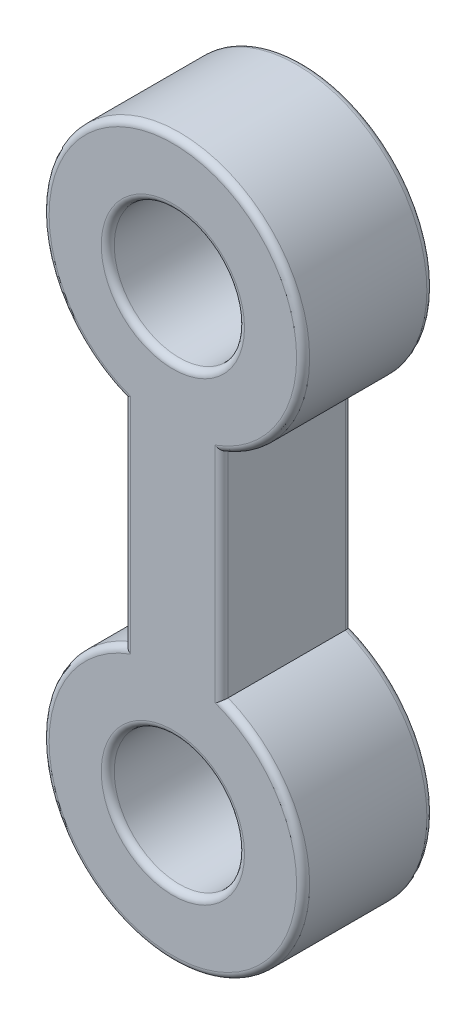
ISO-10303-21;
HEADER;
FILE_DESCRIPTION(('STEP AP214'),'2;1');
FILE_NAME('part.step','',(''),(''),'','','');
FILE_SCHEMA(('AUTOMOTIVE_DESIGN { 1 0 10303 214 1 1 1 1 }'));
ENDSEC;
DATA;
#1=APPLICATION_CONTEXT('core data for automotive mechanical design processes');
#2=APPLICATION_PROTOCOL_DEFINITION('international standard','automotive_design',2000,#1);
#3=PRODUCT_CONTEXT('',#1,'mechanical');
#4=PRODUCT('Part','Part','',(#3));
#5=PRODUCT_RELATED_PRODUCT_CATEGORY('part','',(#4));
#6=PRODUCT_DEFINITION_FORMATION('','',#4);
#7=PRODUCT_DEFINITION_CONTEXT('part definition',#1,'design');
#8=PRODUCT_DEFINITION('design','',#6,#7);
#9=PRODUCT_DEFINITION_SHAPE('','',#8);
#10=(LENGTH_UNIT() NAMED_UNIT(*) SI_UNIT(.MILLI.,.METRE.));
#11=(NAMED_UNIT(*) PLANE_ANGLE_UNIT() SI_UNIT($,.RADIAN.));
#12=(NAMED_UNIT(*) SI_UNIT($,.STERADIAN.) SOLID_ANGLE_UNIT());
#13=UNCERTAINTY_MEASURE_WITH_UNIT(LENGTH_MEASURE(1.E-05),#10,'distance_accuracy_value','');
#14=(GEOMETRIC_REPRESENTATION_CONTEXT(3) GLOBAL_UNCERTAINTY_ASSIGNED_CONTEXT((#13)) GLOBAL_UNIT_ASSIGNED_CONTEXT((#10,
#11,#12)) REPRESENTATION_CONTEXT('',''));
#15=CARTESIAN_POINT('',(0.,0.,0.));
#16=DIRECTION('',(0.,0.,1.));
#17=DIRECTION('',(1.,0.,0.));
#18=AXIS2_PLACEMENT_3D('',#15,#16,#17);
#19=CARTESIAN_POINT('',(0.,0.,10.));
#20=DIRECTION('',(0.,0.,1.));
#21=DIRECTION('',(1.,0.,0.));
#22=AXIS2_PLACEMENT_3D('',#19,#20,#21);
#23=PLANE('',#22);
#24=CARTESIAN_POINT('',(0.,-70.0000000000001,10.));
#25=DIRECTION('',(0.,0.,1.));
#26=DIRECTION('',(1.,0.,0.));
#27=AXIS2_PLACEMENT_3D('',#24,#25,#26);
#28=CIRCLE('',#27,11.);
#29=CARTESIAN_POINT('',(11.,-70.0000000000001,10.));
#30=VERTEX_POINT('',#29);
#31=EDGE_CURVE('E11',#30,#30,#28,.F.);
#32=ORIENTED_EDGE('',*,*,#31,.T.);
#33=EDGE_LOOP('',(#32));
#34=FACE_BOUND('',#33,.T.);
#35=CARTESIAN_POINT('',(0.,-70.0000000000001,10.));
#36=DIRECTION('',(0.,0.,1.));
#37=DIRECTION('',(1.,0.,0.));
#38=AXIS2_PLACEMENT_3D('',#35,#36,#37);
#39=CIRCLE('',#38,19.);
#40=CARTESIAN_POINT('',(-6.49999999999998,-52.1464289286429,10.));
#41=VERTEX_POINT('',#40);
#42=CARTESIAN_POINT('',(6.49999999999999,-52.1464289286429,10.));
#43=VERTEX_POINT('',#42);
#44=EDGE_CURVE('E66',#41,#43,#39,.T.);
#45=ORIENTED_EDGE('',*,*,#44,.T.);
#46=DIRECTION('',(0.,1.,0.));
#47=VECTOR('',#46,1.);
#48=CARTESIAN_POINT('',(6.49999999999998,-18.5404962177392,10.));
#49=LINE('',#48,#47);
#50=CARTESIAN_POINT('',(6.49999999999998,-17.8535710713571,10.));
#51=VERTEX_POINT('',#50);
#52=EDGE_CURVE('E58',#43,#51,#49,.T.);
#53=ORIENTED_EDGE('',*,*,#52,.T.);
#54=CARTESIAN_POINT('',(0.,0.,10.));
#55=DIRECTION('',(0.,0.,1.));
#56=DIRECTION('',(1.,0.,0.));
#57=AXIS2_PLACEMENT_3D('',#54,#55,#56);
#58=CIRCLE('',#57,19.);
#59=CARTESIAN_POINT('',(-6.49999999999998,-17.8535710713571,10.));
#60=VERTEX_POINT('',#59);
#61=EDGE_CURVE('E203',#51,#60,#58,.T.);
#62=ORIENTED_EDGE('',*,*,#61,.T.);
#63=DIRECTION('',(0.,-1.,0.));
#64=VECTOR('',#63,1.);
#65=CARTESIAN_POINT('',(-6.49999999999998,-51.4595037822609,10.));
#66=LINE('',#65,#64);
#67=EDGE_CURVE('E71',#60,#41,#66,.T.);
#68=ORIENTED_EDGE('',*,*,#67,.T.);
#69=EDGE_LOOP('',(#45,#53,#62,#68));
#70=FACE_BOUND('',#69,.T.);
#71=CARTESIAN_POINT('',(0.,0.,10.));
#72=DIRECTION('',(0.,0.,1.));
#73=DIRECTION('',(1.,0.,0.));
#74=AXIS2_PLACEMENT_3D('',#71,#72,#73);
#75=CIRCLE('',#74,11.);
#76=CARTESIAN_POINT('',(11.,0.,10.));
#77=VERTEX_POINT('',#76);
#78=EDGE_CURVE('E199',#77,#77,#75,.F.);
#79=ORIENTED_EDGE('',*,*,#78,.T.);
#80=EDGE_LOOP('',(#79));
#81=FACE_BOUND('',#80,.T.);
#82=ADVANCED_FACE('F43',(#34,#70,#81),#23,.T.);
#83=CARTESIAN_POINT('',(0.,0.,-10.));
#84=DIRECTION('',(0.,0.,1.));
#85=DIRECTION('',(1.,0.,0.));
#86=AXIS2_PLACEMENT_3D('',#83,#84,#85);
#87=PLANE('',#86);
#88=CARTESIAN_POINT('',(0.,-70.0000000000001,-10.));
#89=DIRECTION('',(0.,0.,1.));
#90=DIRECTION('',(1.,0.,0.));
#91=AXIS2_PLACEMENT_3D('',#88,#89,#90);
#92=CIRCLE('',#91,11.);
#93=CARTESIAN_POINT('',(11.,-70.0000000000001,-10.));
#94=VERTEX_POINT('',#93);
#95=EDGE_CURVE('E151',#94,#94,#92,.T.);
#96=ORIENTED_EDGE('',*,*,#95,.T.);
#97=EDGE_LOOP('',(#96));
#98=FACE_BOUND('',#97,.T.);
#99=CARTESIAN_POINT('',(0.,0.,-10.));
#100=DIRECTION('',(0.,0.,1.));
#101=DIRECTION('',(1.,0.,0.));
#102=AXIS2_PLACEMENT_3D('',#99,#100,#101);
#103=CIRCLE('',#102,11.);
#104=CARTESIAN_POINT('',(11.,0.,-10.));
#105=VERTEX_POINT('',#104);
#106=EDGE_CURVE('E146',#105,#105,#103,.T.);
#107=ORIENTED_EDGE('',*,*,#106,.T.);
#108=EDGE_LOOP('',(#107));
#109=FACE_BOUND('',#108,.T.);
#110=CARTESIAN_POINT('',(0.,-70.0000000000001,-10.));
#111=DIRECTION('',(0.,0.,1.));
#112=DIRECTION('',(1.,0.,0.));
#113=AXIS2_PLACEMENT_3D('',#110,#111,#112);
#114=CIRCLE('',#113,19.);
#115=CARTESIAN_POINT('',(6.49999999999999,-52.1464289286429,-10.));
#116=VERTEX_POINT('',#115);
#117=CARTESIAN_POINT('',(-6.49999999999998,-52.1464289286429,-10.));
#118=VERTEX_POINT('',#117);
#119=EDGE_CURVE('E144',#116,#118,#114,.F.);
#120=ORIENTED_EDGE('',*,*,#119,.T.);
#121=DIRECTION('',(0.,-1.,0.));
#122=VECTOR('',#121,1.);
#123=CARTESIAN_POINT('',(-6.49999999999998,0.,-10.));
#124=LINE('',#123,#122);
#125=CARTESIAN_POINT('',(-6.49999999999998,-17.8535710713571,-10.));
#126=VERTEX_POINT('',#125);
#127=EDGE_CURVE('E121',#118,#126,#124,.F.);
#128=ORIENTED_EDGE('',*,*,#127,.T.);
#129=CARTESIAN_POINT('',(0.,0.,-10.));
#130=DIRECTION('',(0.,0.,1.));
#131=DIRECTION('',(1.,0.,0.));
#132=AXIS2_PLACEMENT_3D('',#129,#130,#131);
#133=CIRCLE('',#132,19.);
#134=CARTESIAN_POINT('',(6.49999999999998,-17.8535710713571,-10.));
#135=VERTEX_POINT('',#134);
#136=EDGE_CURVE('E132',#126,#135,#133,.F.);
#137=ORIENTED_EDGE('',*,*,#136,.T.);
#138=DIRECTION('',(0.,1.,0.));
#139=VECTOR('',#138,1.);
#140=CARTESIAN_POINT('',(6.49999999999998,0.,-10.));
#141=LINE('',#140,#139);
#142=EDGE_CURVE('E139',#135,#116,#141,.F.);
#143=ORIENTED_EDGE('',*,*,#142,.T.);
#144=EDGE_LOOP('',(#120,#128,#137,#143));
#145=FACE_BOUND('',#144,.T.);
#146=ADVANCED_FACE('F142',(#98,#109,#145),#87,.F.);
#147=CARTESIAN_POINT('',(0.,0.,10.));
#148=DIRECTION('',(0.,0.,-1.));
#149=DIRECTION('',(-1.,0.,0.));
#150=AXIS2_PLACEMENT_3D('',#147,#148,#149);
#151=CYLINDRICAL_SURFACE('',#150,20.);
#152=DIRECTION('',(0.,0.,-1.));
#153=VECTOR('',#152,1.);
#154=CARTESIAN_POINT('',(7.49999999999998,-18.5404962177392,10.));
#155=LINE('',#154,#153);
#156=CARTESIAN_POINT('',(7.49999999999998,-18.5404962177392,9.));
#157=VERTEX_POINT('',#156);
#158=CARTESIAN_POINT('',(7.49999999999998,-18.5404962177392,-9.));
#159=VERTEX_POINT('',#158);
#160=EDGE_CURVE('E364',#157,#159,#155,.T.);
#161=ORIENTED_EDGE('',*,*,#160,.T.);
#162=CARTESIAN_POINT('',(0.,0.,-9.));
#163=DIRECTION('',(0.,0.,1.));
#164=DIRECTION('',(1.,0.,0.));
#165=AXIS2_PLACEMENT_3D('',#162,#163,#164);
#166=CIRCLE('',#165,20.);
#167=CARTESIAN_POINT('',(-7.49999999999998,-18.5404962177392,-9.));
#168=VERTEX_POINT('',#167);
#169=EDGE_CURVE('E196',#159,#168,#166,.T.);
#170=ORIENTED_EDGE('',*,*,#169,.T.);
#171=DIRECTION('',(0.,0.,-1.));
#172=VECTOR('',#171,1.);
#173=CARTESIAN_POINT('',(-7.49999999999998,-18.5404962177392,10.));
#174=LINE('',#173,#172);
#175=CARTESIAN_POINT('',(-7.49999999999998,-18.5404962177392,9.));
#176=VERTEX_POINT('',#175);
#177=EDGE_CURVE('E140',#176,#168,#174,.T.);
#178=ORIENTED_EDGE('',*,*,#177,.F.);
#179=CARTESIAN_POINT('',(0.,0.,9.));
#180=DIRECTION('',(0.,0.,1.));
#181=DIRECTION('',(1.,0.,0.));
#182=AXIS2_PLACEMENT_3D('',#179,#180,#181);
#183=CIRCLE('',#182,20.);
#184=EDGE_CURVE('E193',#176,#157,#183,.F.);
#185=ORIENTED_EDGE('',*,*,#184,.T.);
#186=EDGE_LOOP('',(#161,#170,#178,#185));
#187=FACE_BOUND('',#186,.T.);
#188=ADVANCED_FACE('F302',(#187),#151,.T.);
#189=CARTESIAN_POINT('',(-7.49999999999998,-18.5404962177392,10.));
#190=DIRECTION('',(1.,0.,0.));
#191=DIRECTION('',(0.,0.,-1.));
#192=AXIS2_PLACEMENT_3D('',#189,#190,#191);
#193=PLANE('',#192);
#194=ORIENTED_EDGE('',*,*,#177,.T.);
#195=DIRECTION('',(0.,-1.,0.));
#196=VECTOR('',#195,1.);
#197=CARTESIAN_POINT('',(-7.49999999999998,-18.5404962177392,-9.));
#198=LINE('',#197,#196);
#199=CARTESIAN_POINT('',(-7.49999999999998,-51.4595037822609,-9.));
#200=VERTEX_POINT('',#199);
#201=EDGE_CURVE('E124',#168,#200,#198,.T.);
#202=ORIENTED_EDGE('',*,*,#201,.T.);
#203=DIRECTION('',(0.,0.,-1.));
#204=VECTOR('',#203,1.);
#205=CARTESIAN_POINT('',(-7.49999999999998,-51.4595037822609,10.));
#206=LINE('',#205,#204);
#207=CARTESIAN_POINT('',(-7.49999999999998,-51.4595037822609,9.));
#208=VERTEX_POINT('',#207);
#209=EDGE_CURVE('E367',#208,#200,#206,.T.);
#210=ORIENTED_EDGE('',*,*,#209,.F.);
#211=DIRECTION('',(0.,-1.,0.));
#212=VECTOR('',#211,1.);
#213=CARTESIAN_POINT('',(-7.49999999999998,-18.5404962177392,9.));
#214=LINE('',#213,#212);
#215=EDGE_CURVE('E175',#208,#176,#214,.F.);
#216=ORIENTED_EDGE('',*,*,#215,.T.);
#217=EDGE_LOOP('',(#194,#202,#210,#216));
#218=FACE_BOUND('',#217,.T.);
#219=ADVANCED_FACE('F316',(#218),#193,.F.);
#220=CARTESIAN_POINT('',(0.,-70.0000000000001,10.));
#221=DIRECTION('',(0.,0.,-1.));
#222=DIRECTION('',(-1.,0.,0.));
#223=AXIS2_PLACEMENT_3D('',#220,#221,#222);
#224=CYLINDRICAL_SURFACE('',#223,20.);
#225=ORIENTED_EDGE('',*,*,#209,.T.);
#226=CARTESIAN_POINT('',(0.,-70.0000000000001,-9.));
#227=DIRECTION('',(0.,0.,1.));
#228=DIRECTION('',(1.,0.,0.));
#229=AXIS2_PLACEMENT_3D('',#226,#227,#228);
#230=CIRCLE('',#229,20.);
#231=CARTESIAN_POINT('',(7.49999999999999,-51.4595037822609,-9.));
#232=VERTEX_POINT('',#231);
#233=EDGE_CURVE('E183',#200,#232,#230,.T.);
#234=ORIENTED_EDGE('',*,*,#233,.T.);
#235=DIRECTION('',(0.,0.,-1.));
#236=VECTOR('',#235,1.);
#237=CARTESIAN_POINT('',(7.49999999999999,-51.4595037822609,10.));
#238=LINE('',#237,#236);
#239=CARTESIAN_POINT('',(7.49999999999999,-51.4595037822609,9.));
#240=VERTEX_POINT('',#239);
#241=EDGE_CURVE('E361',#240,#232,#238,.T.);
#242=ORIENTED_EDGE('',*,*,#241,.F.);
#243=CARTESIAN_POINT('',(0.,-70.0000000000001,9.));
#244=DIRECTION('',(0.,0.,1.));
#245=DIRECTION('',(1.,0.,0.));
#246=AXIS2_PLACEMENT_3D('',#243,#244,#245);
#247=CIRCLE('',#246,20.);
#248=EDGE_CURVE('E180',#240,#208,#247,.F.);
#249=ORIENTED_EDGE('',*,*,#248,.T.);
#250=EDGE_LOOP('',(#225,#234,#242,#249));
#251=FACE_BOUND('',#250,.T.);
#252=ADVANCED_FACE('F312',(#251),#224,.T.);
#253=CARTESIAN_POINT('',(7.49999999999998,-18.5404962177392,10.));
#254=DIRECTION('',(-1.,0.,0.));
#255=DIRECTION('',(0.,-1.,0.));
#256=AXIS2_PLACEMENT_3D('',#253,#254,#255);
#257=PLANE('',#256);
#258=ORIENTED_EDGE('',*,*,#241,.T.);
#259=DIRECTION('',(0.,1.,0.));
#260=VECTOR('',#259,1.);
#261=CARTESIAN_POINT('',(7.49999999999998,-18.5404962177392,-9.));
#262=LINE('',#261,#260);
#263=EDGE_CURVE('E190',#232,#159,#262,.T.);
#264=ORIENTED_EDGE('',*,*,#263,.T.);
#265=ORIENTED_EDGE('',*,*,#160,.F.);
#266=DIRECTION('',(0.,1.,0.));
#267=VECTOR('',#266,1.);
#268=CARTESIAN_POINT('',(7.49999999999999,-51.4595037822609,9.));
#269=LINE('',#268,#267);
#270=EDGE_CURVE('E186',#157,#240,#269,.F.);
#271=ORIENTED_EDGE('',*,*,#270,.T.);
#272=EDGE_LOOP('',(#258,#264,#265,#271));
#273=FACE_BOUND('',#272,.T.);
#274=ADVANCED_FACE('F309',(#273),#257,.F.);
#275=CARTESIAN_POINT('',(0.,0.,10.));
#276=DIRECTION('',(0.,0.,-1.));
#277=DIRECTION('',(-1.,0.,0.));
#278=AXIS2_PLACEMENT_3D('',#275,#276,#277);
#279=CYLINDRICAL_SURFACE('',#278,9.99999999999999);
#280=CARTESIAN_POINT('',(0.,0.,-9.));
#281=DIRECTION('',(0.,0.,1.));
#282=DIRECTION('',(1.,0.,0.));
#283=AXIS2_PLACEMENT_3D('',#280,#281,#282);
#284=CIRCLE('',#283,9.99999999999999);
#285=CARTESIAN_POINT('',(9.99999999999999,0.,-9.));
#286=VERTEX_POINT('',#285);
#287=EDGE_CURVE('E171',#286,#286,#284,.F.);
#288=ORIENTED_EDGE('',*,*,#287,.T.);
#289=EDGE_LOOP('',(#288));
#290=FACE_BOUND('',#289,.T.);
#291=CARTESIAN_POINT('',(0.,0.,9.));
#292=DIRECTION('',(0.,0.,1.));
#293=DIRECTION('',(1.,0.,0.));
#294=AXIS2_PLACEMENT_3D('',#291,#292,#293);
#295=CIRCLE('',#294,9.99999999999999);
#296=CARTESIAN_POINT('',(9.99999999999999,0.,9.));
#297=VERTEX_POINT('',#296);
#298=EDGE_CURVE('E167',#297,#297,#295,.T.);
#299=ORIENTED_EDGE('',*,*,#298,.T.);
#300=EDGE_LOOP('',(#299));
#301=FACE_BOUND('',#300,.T.);
#302=ADVANCED_FACE('F306',(#290,#301),#279,.F.);
#303=CARTESIAN_POINT('',(0.,-70.0000000000001,10.));
#304=DIRECTION('',(0.,0.,-1.));
#305=DIRECTION('',(-1.,0.,0.));
#306=AXIS2_PLACEMENT_3D('',#303,#304,#305);
#307=CYLINDRICAL_SURFACE('',#306,10.);
#308=CARTESIAN_POINT('',(0.,-70.0000000000001,-9.));
#309=DIRECTION('',(0.,0.,1.));
#310=DIRECTION('',(1.,0.,0.));
#311=AXIS2_PLACEMENT_3D('',#308,#309,#310);
#312=CIRCLE('',#311,10.);
#313=CARTESIAN_POINT('',(10.,-70.0000000000001,-9.));
#314=VERTEX_POINT('',#313);
#315=EDGE_CURVE('E163',#314,#314,#312,.F.);
#316=ORIENTED_EDGE('',*,*,#315,.T.);
#317=EDGE_LOOP('',(#316));
#318=FACE_BOUND('',#317,.T.);
#319=CARTESIAN_POINT('',(0.,-70.0000000000001,9.));
#320=DIRECTION('',(0.,0.,1.));
#321=DIRECTION('',(1.,0.,0.));
#322=AXIS2_PLACEMENT_3D('',#319,#320,#321);
#323=CIRCLE('',#322,10.);
#324=CARTESIAN_POINT('',(10.,-70.0000000000001,9.));
#325=VERTEX_POINT('',#324);
#326=EDGE_CURVE('E159',#325,#325,#323,.T.);
#327=ORIENTED_EDGE('',*,*,#326,.T.);
#328=EDGE_LOOP('',(#327));
#329=FACE_BOUND('',#328,.T.);
#330=ADVANCED_FACE('F326',(#318,#329),#307,.F.);
#331=CARTESIAN_POINT('',(0.,-70.0000000000001,-9.));
#332=DIRECTION('',(0.,0.,1.));
#333=DIRECTION('',(1.,0.,0.));
#334=AXIS2_PLACEMENT_3D('',#331,#332,#333);
#335=TOROIDAL_SURFACE('',#334,11.,1.);
#336=ORIENTED_EDGE('',*,*,#315,.F.);
#337=EDGE_LOOP('',(#336));
#338=FACE_BOUND('',#337,.T.);
#339=ORIENTED_EDGE('',*,*,#95,.F.);
#340=EDGE_LOOP('',(#339));
#341=FACE_BOUND('',#340,.T.);
#342=ADVANCED_FACE('F324',(#338,#341),#335,.T.);
#343=CARTESIAN_POINT('',(0.,0.,-9.));
#344=DIRECTION('',(0.,0.,1.));
#345=DIRECTION('',(1.,0.,0.));
#346=AXIS2_PLACEMENT_3D('',#343,#344,#345);
#347=TOROIDAL_SURFACE('',#346,11.,1.);
#348=ORIENTED_EDGE('',*,*,#287,.F.);
#349=EDGE_LOOP('',(#348));
#350=FACE_BOUND('',#349,.T.);
#351=ORIENTED_EDGE('',*,*,#106,.F.);
#352=EDGE_LOOP('',(#351));
#353=FACE_BOUND('',#352,.T.);
#354=ADVANCED_FACE('F250',(#350,#353),#347,.T.);
#355=CARTESIAN_POINT('',(6.49999999999998,-18.5404962177392,-9.));
#356=DIRECTION('',(0.,1.,0.));
#357=DIRECTION('',(-1.,0.,0.));
#358=AXIS2_PLACEMENT_3D('',#355,#356,#357);
#359=CYLINDRICAL_SURFACE('',#358,1.);
#360=CARTESIAN_POINT('',(7.49999999999999,-51.4595037822609,-9.));
#361=CARTESIAN_POINT('',(7.50000189769368,-51.4595026043384,-9.02469557126901));
#362=CARTESIAN_POINT('',(7.49908446359423,-51.4601210271123,-9.04937783193884));
#363=CARTESIAN_POINT('',(7.4954383357305,-51.4625794492258,-9.09853701940789));
#364=CARTESIAN_POINT('',(7.49271038364172,-51.4644189483537,-9.12301402613303));
#365=CARTESIAN_POINT('',(7.48189376100377,-51.4717143578347,-9.19561058121729));
#366=CARTESIAN_POINT('',(7.47117157764477,-51.4789476645999,-9.24319343216988));
#367=CARTESIAN_POINT('',(7.44330371697539,-51.4977655453967,-9.33541207747412));
#368=CARTESIAN_POINT('',(7.42616581189547,-51.5093448545722,-9.38005136111824));
#369=CARTESIAN_POINT('',(7.38628330244705,-51.5363258219173,-9.46554204788778));
#370=CARTESIAN_POINT('',(7.36353264463757,-51.5517316071231,-9.50638929534488));
#371=CARTESIAN_POINT('',(7.31180630701148,-51.5868122556768,-9.58596941034456));
#372=CARTESIAN_POINT('',(7.28253378977323,-51.6066914315319,-9.62441765058433));
#373=CARTESIAN_POINT('',(7.21978477451094,-51.6493848773835,-9.69582434706756));
#374=CARTESIAN_POINT('',(7.18630749885935,-51.6721996903153,-9.72878178521296));
#375=CARTESIAN_POINT('',(7.11040415203341,-51.7240355166642,-9.79391148569648));
#376=CARTESIAN_POINT('',(7.0674067357781,-51.7534633186864,-9.82509293251835));
#377=CARTESIAN_POINT('',(6.97824901474554,-51.8146442306898,-9.87978362130725));
#378=CARTESIAN_POINT('',(6.93208430442949,-51.8464005839609,-9.90328190347744));
#379=CARTESIAN_POINT('',(6.82376706493334,-51.9211187082729,-9.94845139410933));
#380=CARTESIAN_POINT('',(6.76091166467115,-51.9646251240665,-9.96754419030609));
#381=CARTESIAN_POINT('',(6.63376141351092,-52.05296731462,-9.9931274266423));
#382=CARTESIAN_POINT('',(6.56946967618555,-52.0978002715303,-9.99964287098959));
#383=CARTESIAN_POINT('',(6.50356311398426,-52.1439343793164,-9.99999524228929));
#384=CARTESIAN_POINT('',(6.50178148239446,-52.1451816401532,-10.0000000029543));
#385=CARTESIAN_POINT('',(6.49999999999999,-52.1464289286429,-10.));
#386=B_SPLINE_CURVE_WITH_KNOTS('',3,(#360,#361,#362,#363,#364,#365,#366,#367,#368,#369,#370,
#371,#372,#373,#374,#375,#376,#377,#378,#379,#380,#381,#382,#383,#384,#385),.UNSPECIFIED.,.F.,
.F.,(4,2,2,2,2,2,2,2,2,2,2,2,4),(0.,0.0740361905573393,0.148042071024502,0.295173080104486,
0.44212642329059,0.589238956169166,0.745400938242297,0.901591843537982,1.08306771193246,
1.26480133198613,1.50008249081373,1.73489541893545,1.74141988969473),.UNSPECIFIED.);
#387=EDGE_CURVE('E128',#116,#232,#386,.F.);
#388=ORIENTED_EDGE('',*,*,#387,.F.);
#389=ORIENTED_EDGE('',*,*,#142,.F.);
#390=CARTESIAN_POINT('',(7.49999999999998,-18.5404962177392,-9.));
#391=CARTESIAN_POINT('',(7.50000189769368,-18.5404973956616,-9.02469557126901));
#392=CARTESIAN_POINT('',(7.49908446359422,-18.5398789728877,-9.04937783193884));
#393=CARTESIAN_POINT('',(7.49543833573049,-18.5374205507742,-9.09853701940789));
#394=CARTESIAN_POINT('',(7.49271038364171,-18.5355810516463,-9.12301402613303));
#395=CARTESIAN_POINT('',(7.48189376100377,-18.5282856421653,-9.19561058121729));
#396=CARTESIAN_POINT('',(7.47117157764476,-18.5210523354001,-9.24319343216988));
#397=CARTESIAN_POINT('',(7.44330371697539,-18.5022344546033,-9.33541207747412));
#398=CARTESIAN_POINT('',(7.42616581189546,-18.4906551454278,-9.38005136111823));
#399=CARTESIAN_POINT('',(7.38628330244704,-18.4636741780827,-9.46554204788778));
#400=CARTESIAN_POINT('',(7.36353264463756,-18.4482683928769,-9.50638929534488));
#401=CARTESIAN_POINT('',(7.31180630701147,-18.4131877443232,-9.58596941034456));
#402=CARTESIAN_POINT('',(7.28253378977323,-18.3933085684681,-9.62441765058433));
#403=CARTESIAN_POINT('',(7.21978477451094,-18.3506151226166,-9.69582434706756));
#404=CARTESIAN_POINT('',(7.18630749885934,-18.3278003096847,-9.72878178521296));
#405=CARTESIAN_POINT('',(7.1104041520334,-18.2759644833358,-9.79391148569648));
#406=CARTESIAN_POINT('',(7.06740673577809,-18.2465366813136,-9.82509293251835));
#407=CARTESIAN_POINT('',(6.97824901474553,-18.1853557693102,-9.87978362130725));
#408=CARTESIAN_POINT('',(6.93208430442949,-18.1535994160391,-9.90328190347743));
#409=CARTESIAN_POINT('',(6.82376706493334,-18.0788812917271,-9.94845139410932));
#410=CARTESIAN_POINT('',(6.76091166467114,-18.0353748759335,-9.96754419030609));
#411=CARTESIAN_POINT('',(6.63376141351091,-17.94703268538,-9.9931274266423));
#412=CARTESIAN_POINT('',(6.56946967618556,-17.9021997284696,-9.99964287098959));
#413=CARTESIAN_POINT('',(6.50356311398426,-17.8560656206836,-9.99999524228929));
#414=CARTESIAN_POINT('',(6.50178148239445,-17.8548183598468,-10.0000000029543));
#415=CARTESIAN_POINT('',(6.49999999999998,-17.8535710713571,-10.));
#416=B_SPLINE_CURVE_WITH_KNOTS('',3,(#390,#391,#392,#393,#394,#395,#396,#397,#398,#399,#400,
#401,#402,#403,#404,#405,#406,#407,#408,#409,#410,#411,#412,#413,#414,#415),.UNSPECIFIED.,.F.,
.F.,(4,2,2,2,2,2,2,2,2,2,2,2,4),(0.,0.0740361905573395,0.148042071024502,0.295173080104486,
0.442126423290586,0.589238956169167,0.745400938242295,0.901591843537984,1.08306771193246,
1.26480133198613,1.50008249081373,1.73489541893545,1.74141988969473),.UNSPECIFIED.);
#417=EDGE_CURVE('E135',#159,#135,#416,.T.);
#418=ORIENTED_EDGE('',*,*,#417,.F.);
#419=ORIENTED_EDGE('',*,*,#263,.F.);
#420=EDGE_LOOP('',(#388,#389,#418,#419));
#421=FACE_BOUND('',#420,.T.);
#422=ADVANCED_FACE('F246',(#421),#359,.T.);
#423=CARTESIAN_POINT('',(0.,0.,-9.));
#424=DIRECTION('',(0.,0.,1.));
#425=DIRECTION('',(1.,0.,0.));
#426=AXIS2_PLACEMENT_3D('',#423,#424,#425);
#427=TOROIDAL_SURFACE('',#426,19.,1.);
#428=ORIENTED_EDGE('',*,*,#417,.T.);
#429=ORIENTED_EDGE('',*,*,#136,.F.);
#430=CARTESIAN_POINT('',(-7.49999999999998,-18.5404962177392,-9.));
#431=CARTESIAN_POINT('',(-7.50000189769367,-18.5404973956616,-9.02469557126901));
#432=CARTESIAN_POINT('',(-7.49908446359421,-18.5398789728877,-9.04937783193884));
#433=CARTESIAN_POINT('',(-7.49543833573049,-18.5374205507742,-9.09853701940789));
#434=CARTESIAN_POINT('',(-7.49271038364171,-18.5355810516463,-9.12301402613303));
#435=CARTESIAN_POINT('',(-7.48189376100376,-18.5282856421653,-9.19561058121729));
#436=CARTESIAN_POINT('',(-7.47117157764476,-18.5210523354001,-9.24319343216988));
#437=CARTESIAN_POINT('',(-7.44330371697538,-18.5022344546033,-9.33541207747412));
#438=CARTESIAN_POINT('',(-7.42616581189546,-18.4906551454278,-9.38005136111824));
#439=CARTESIAN_POINT('',(-7.38628330244704,-18.4636741780827,-9.46554204788778));
#440=CARTESIAN_POINT('',(-7.36353264463756,-18.4482683928769,-9.50638929534488));
#441=CARTESIAN_POINT('',(-7.31180630701147,-18.4131877443232,-9.58596941034455));
#442=CARTESIAN_POINT('',(-7.28253378977322,-18.3933085684681,-9.62441765058433));
#443=CARTESIAN_POINT('',(-7.21978477451093,-18.3506151226166,-9.69582434706756));
#444=CARTESIAN_POINT('',(-7.18630749885933,-18.3278003096847,-9.72878178521296));
#445=CARTESIAN_POINT('',(-7.1104041520334,-18.2759644833358,-9.79391148569648));
#446=CARTESIAN_POINT('',(-7.06740673577809,-18.2465366813136,-9.82509293251835));
#447=CARTESIAN_POINT('',(-6.97824901474553,-18.1853557693102,-9.87978362130725));
#448=CARTESIAN_POINT('',(-6.93208430442948,-18.1535994160391,-9.90328190347744));
#449=CARTESIAN_POINT('',(-6.82376706493333,-18.0788812917271,-9.94845139410933));
#450=CARTESIAN_POINT('',(-6.76091166467114,-18.0353748759335,-9.96754419030609));
#451=CARTESIAN_POINT('',(-6.63376141351091,-17.94703268538,-9.9931274266423));
#452=CARTESIAN_POINT('',(-6.56946967618555,-17.9021997284697,-9.99964287098959));
#453=CARTESIAN_POINT('',(-6.50356311398425,-17.8560656206836,-9.99999524228929));
#454=CARTESIAN_POINT('',(-6.50178148239445,-17.8548183598468,-10.0000000029543));
#455=CARTESIAN_POINT('',(-6.49999999999998,-17.8535710713571,-10.));
#456=B_SPLINE_CURVE_WITH_KNOTS('',3,(#430,#431,#432,#433,#434,#435,#436,#437,#438,#439,#440,
#441,#442,#443,#444,#445,#446,#447,#448,#449,#450,#451,#452,#453,#454,#455),.UNSPECIFIED.,.F.,
.F.,(4,2,2,2,2,2,2,2,2,2,2,2,4),(0.,0.0740361905573395,0.148042071024501,0.295173080104486,
0.442126423290588,0.589238956169166,0.745400938242298,0.901591843537985,1.08306771193246,
1.26480133198613,1.50008249081373,1.73489541893545,1.74141988969473),.UNSPECIFIED.);
#457=EDGE_CURVE('E117',#168,#126,#456,.T.);
#458=ORIENTED_EDGE('',*,*,#457,.F.);
#459=ORIENTED_EDGE('',*,*,#169,.F.);
#460=EDGE_LOOP('',(#428,#429,#458,#459));
#461=FACE_BOUND('',#460,.T.);
#462=ADVANCED_FACE('F133',(#461),#427,.T.);
#463=CARTESIAN_POINT('',(0.,-70.0000000000001,-9.));
#464=DIRECTION('',(0.,0.,1.));
#465=DIRECTION('',(1.,0.,0.));
#466=AXIS2_PLACEMENT_3D('',#463,#464,#465);
#467=TOROIDAL_SURFACE('',#466,19.,1.);
#468=ORIENTED_EDGE('',*,*,#387,.T.);
#469=ORIENTED_EDGE('',*,*,#233,.F.);
#470=CARTESIAN_POINT('',(-7.49999999999998,-51.4595037822609,-9.));
#471=CARTESIAN_POINT('',(-7.50000189769367,-51.4595026043384,-9.02469557126901));
#472=CARTESIAN_POINT('',(-7.49908446359421,-51.4601210271123,-9.04937783193884));
#473=CARTESIAN_POINT('',(-7.49543833573049,-51.4625794492258,-9.09853701940789));
#474=CARTESIAN_POINT('',(-7.49271038364171,-51.4644189483537,-9.12301402613303));
#475=CARTESIAN_POINT('',(-7.48189376100376,-51.4717143578347,-9.19561058121729));
#476=CARTESIAN_POINT('',(-7.47117157764476,-51.4789476645999,-9.24319343216988));
#477=CARTESIAN_POINT('',(-7.44330371697538,-51.4977655453967,-9.33541207747412));
#478=CARTESIAN_POINT('',(-7.42616581189546,-51.5093448545722,-9.38005136111823));
#479=CARTESIAN_POINT('',(-7.38628330244704,-51.5363258219173,-9.46554204788778));
#480=CARTESIAN_POINT('',(-7.36353264463756,-51.5517316071231,-9.50638929534488));
#481=CARTESIAN_POINT('',(-7.31180630701147,-51.5868122556768,-9.58596941034456));
#482=CARTESIAN_POINT('',(-7.28253378977322,-51.6066914315319,-9.62441765058433));
#483=CARTESIAN_POINT('',(-7.21978477451093,-51.6493848773835,-9.69582434706756));
#484=CARTESIAN_POINT('',(-7.18630749885933,-51.6721996903153,-9.72878178521296));
#485=CARTESIAN_POINT('',(-7.1104041520334,-51.7240355166642,-9.79391148569648));
#486=CARTESIAN_POINT('',(-7.06740673577808,-51.7534633186864,-9.82509293251835));
#487=CARTESIAN_POINT('',(-6.97824901474553,-51.8146442306898,-9.87978362130725));
#488=CARTESIAN_POINT('',(-6.93208430442949,-51.8464005839609,-9.90328190347743));
#489=CARTESIAN_POINT('',(-6.82376706493332,-51.9211187082729,-9.94845139410932));
#490=CARTESIAN_POINT('',(-6.7609116646711,-51.9646251240664,-9.96754419030609));
#491=CARTESIAN_POINT('',(-6.63376141351093,-52.05296731462,-9.9931274266423));
#492=CARTESIAN_POINT('',(-6.56946967618566,-52.0978002715305,-9.99964287098959));
#493=CARTESIAN_POINT('',(-6.50356311398425,-52.1439343793164,-9.99999524228929));
#494=CARTESIAN_POINT('',(-6.50178148239445,-52.1451816401532,-10.0000000029543));
#495=CARTESIAN_POINT('',(-6.49999999999998,-52.1464289286429,-10.));
#496=B_SPLINE_CURVE_WITH_KNOTS('',3,(#470,#471,#472,#473,#474,#475,#476,#477,#478,#479,#480,
#481,#482,#483,#484,#485,#486,#487,#488,#489,#490,#491,#492,#493,#494,#495),.UNSPECIFIED.,.F.,
.F.,(4,2,2,2,2,2,2,2,2,2,2,2,4),(0.,0.0740361905573393,0.148042071024502,0.295173080104486,
0.442126423290585,0.589238956169166,0.745400938242299,0.901591843537987,1.08306771193246,
1.26480133198613,1.50008249081373,1.73489541893546,1.74141988969473),.UNSPECIFIED.);
#497=EDGE_CURVE('E129',#118,#200,#496,.F.);
#498=ORIENTED_EDGE('',*,*,#497,.F.);
#499=ORIENTED_EDGE('',*,*,#119,.F.);
#500=EDGE_LOOP('',(#468,#469,#498,#499));
#501=FACE_BOUND('',#500,.T.);
#502=ADVANCED_FACE('F227',(#501),#467,.T.);
#503=CARTESIAN_POINT('',(-6.49999999999998,-18.5404962177392,-9.));
#504=DIRECTION('',(0.,-1.,0.));
#505=DIRECTION('',(0.,0.,-1.));
#506=AXIS2_PLACEMENT_3D('',#503,#504,#505);
#507=CYLINDRICAL_SURFACE('',#506,1.);
#508=ORIENTED_EDGE('',*,*,#457,.T.);
#509=ORIENTED_EDGE('',*,*,#127,.F.);
#510=ORIENTED_EDGE('',*,*,#497,.T.);
#511=ORIENTED_EDGE('',*,*,#201,.F.);
#512=EDGE_LOOP('',(#508,#509,#510,#511));
#513=FACE_BOUND('',#512,.T.);
#514=ADVANCED_FACE('F119',(#513),#507,.T.);
#515=CARTESIAN_POINT('',(0.,-70.0000000000001,9.));
#516=DIRECTION('',(0.,0.,1.));
#517=DIRECTION('',(1.,0.,0.));
#518=AXIS2_PLACEMENT_3D('',#515,#516,#517);
#519=TOROIDAL_SURFACE('',#518,11.,1.);
#520=ORIENTED_EDGE('',*,*,#31,.F.);
#521=EDGE_LOOP('',(#520));
#522=FACE_BOUND('',#521,.T.);
#523=ORIENTED_EDGE('',*,*,#326,.F.);
#524=EDGE_LOOP('',(#523));
#525=FACE_BOUND('',#524,.T.);
#526=ADVANCED_FACE('F252',(#522,#525),#519,.T.);
#527=CARTESIAN_POINT('',(-6.49999999999998,0.,9.));
#528=DIRECTION('',(0.,1.,0.));
#529=DIRECTION('',(0.,0.,1.));
#530=AXIS2_PLACEMENT_3D('',#527,#528,#529);
#531=CYLINDRICAL_SURFACE('',#530,1.);
#532=CARTESIAN_POINT('',(-7.49999999999998,-18.5404962177392,9.));
#533=CARTESIAN_POINT('',(-7.50000189769367,-18.5404973956616,9.02469557126901));
#534=CARTESIAN_POINT('',(-7.49908446359421,-18.5398789728877,9.04937783193884));
#535=CARTESIAN_POINT('',(-7.49543833573049,-18.5374205507742,9.09853701940789));
#536=CARTESIAN_POINT('',(-7.49271038364171,-18.5355810516463,9.12301402613303));
#537=CARTESIAN_POINT('',(-7.48189376100376,-18.5282856421653,9.19561058121729));
#538=CARTESIAN_POINT('',(-7.47117157764476,-18.5210523354001,9.24319343216988));
#539=CARTESIAN_POINT('',(-7.44330371697538,-18.5022344546033,9.33541207747411));
#540=CARTESIAN_POINT('',(-7.42616581189546,-18.4906551454278,9.38005136111823));
#541=CARTESIAN_POINT('',(-7.38628330244704,-18.4636741780827,9.46554204788778));
#542=CARTESIAN_POINT('',(-7.36353264463756,-18.4482683928769,9.50638929534488));
#543=CARTESIAN_POINT('',(-7.31180630701147,-18.4131877443232,9.58596941034455));
#544=CARTESIAN_POINT('',(-7.28253378977322,-18.3933085684681,9.62441765058433));
#545=CARTESIAN_POINT('',(-7.21978477451093,-18.3506151226166,9.69582434706756));
#546=CARTESIAN_POINT('',(-7.18630749885933,-18.3278003096847,9.72878178521296));
#547=CARTESIAN_POINT('',(-7.1104041520334,-18.2759644833358,9.79391148569648));
#548=CARTESIAN_POINT('',(-7.06740673577809,-18.2465366813136,9.82509293251835));
#549=CARTESIAN_POINT('',(-6.97824901474552,-18.1853557693102,9.87978362130724));
#550=CARTESIAN_POINT('',(-6.93208430442948,-18.1535994160391,9.90328190347743));
#551=CARTESIAN_POINT('',(-6.82376706493333,-18.0788812917271,9.94845139410932));
#552=CARTESIAN_POINT('',(-6.76091166467114,-18.0353748759335,9.96754419030609));
#553=CARTESIAN_POINT('',(-6.63376141351091,-17.94703268538,9.9931274266423));
#554=CARTESIAN_POINT('',(-6.56946967618555,-17.9021997284697,9.99964287098958));
#555=CARTESIAN_POINT('',(-6.50356311398425,-17.8560656206836,9.99999524228929));
#556=CARTESIAN_POINT('',(-6.50178148239445,-17.8548183598468,10.0000000029543));
#557=CARTESIAN_POINT('',(-6.49999999999998,-17.8535710713571,10.));
#558=B_SPLINE_CURVE_WITH_KNOTS('',3,(#532,#533,#534,#535,#536,#537,#538,#539,#540,#541,#542,
#543,#544,#545,#546,#547,#548,#549,#550,#551,#552,#553,#554,#555,#556,#557),.UNSPECIFIED.,.F.,
.F.,(4,2,2,2,2,2,2,2,2,2,2,2,4),(0.,0.0740361905573395,0.148042071024501,0.295173080104486,
0.442126423290588,0.589238956169166,0.745400938242299,0.901591843537985,1.08306771193246,
1.26480133198613,1.50008249081373,1.73489541893545,1.74141988969473),.UNSPECIFIED.);
#559=EDGE_CURVE('E273',#176,#60,#558,.T.);
#560=ORIENTED_EDGE('',*,*,#559,.F.);
#561=ORIENTED_EDGE('',*,*,#215,.F.);
#562=CARTESIAN_POINT('',(-7.49999999999998,-51.4595037822609,9.));
#563=CARTESIAN_POINT('',(-7.50000189769367,-51.4595026043384,9.02469557126901));
#564=CARTESIAN_POINT('',(-7.49908446359421,-51.4601210271123,9.04937783193884));
#565=CARTESIAN_POINT('',(-7.49543833573049,-51.4625794492258,9.09853701940789));
#566=CARTESIAN_POINT('',(-7.49271038364171,-51.4644189483537,9.12301402613303));
#567=CARTESIAN_POINT('',(-7.48189376100376,-51.4717143578347,9.19561058121729));
#568=CARTESIAN_POINT('',(-7.47117157764476,-51.4789476645999,9.24319343216988));
#569=CARTESIAN_POINT('',(-7.44330371697538,-51.4977655453967,9.33541207747411));
#570=CARTESIAN_POINT('',(-7.42616581189546,-51.5093448545722,9.38005136111823));
#571=CARTESIAN_POINT('',(-7.38628330244704,-51.5363258219173,9.46554204788778));
#572=CARTESIAN_POINT('',(-7.36353264463756,-51.5517316071231,9.50638929534488));
#573=CARTESIAN_POINT('',(-7.31180630701147,-51.5868122556768,9.58596941034455));
#574=CARTESIAN_POINT('',(-7.28253378977322,-51.6066914315319,9.62441765058433));
#575=CARTESIAN_POINT('',(-7.21978477451093,-51.6493848773835,9.69582434706756));
#576=CARTESIAN_POINT('',(-7.18630749885933,-51.6721996903153,9.72878178521296));
#577=CARTESIAN_POINT('',(-7.1104041520334,-51.7240355166642,9.79391148569648));
#578=CARTESIAN_POINT('',(-7.06740673577808,-51.7534633186864,9.82509293251835));
#579=CARTESIAN_POINT('',(-6.97824901474553,-51.8146442306898,9.87978362130724));
#580=CARTESIAN_POINT('',(-6.93208430442949,-51.8464005839609,9.90328190347743));
#581=CARTESIAN_POINT('',(-6.82376706493332,-51.9211187082729,9.94845139410932));
#582=CARTESIAN_POINT('',(-6.7609116646711,-51.9646251240664,9.96754419030609));
#583=CARTESIAN_POINT('',(-6.63376141351093,-52.05296731462,9.9931274266423));
#584=CARTESIAN_POINT('',(-6.56946967618566,-52.0978002715305,9.99964287098958));
#585=CARTESIAN_POINT('',(-6.50356311398425,-52.1439343793164,9.99999524228929));
#586=CARTESIAN_POINT('',(-6.50178148239445,-52.1451816401532,10.0000000029543));
#587=CARTESIAN_POINT('',(-6.49999999999998,-52.1464289286429,10.));
#588=B_SPLINE_CURVE_WITH_KNOTS('',3,(#562,#563,#564,#565,#566,#567,#568,#569,#570,#571,#572,
#573,#574,#575,#576,#577,#578,#579,#580,#581,#582,#583,#584,#585,#586,#587),.UNSPECIFIED.,.F.,
.F.,(4,2,2,2,2,2,2,2,2,2,2,2,4),(0.,0.0740361905573393,0.148042071024502,0.295173080104486,
0.442126423290586,0.589238956169166,0.745400938242299,0.901591843537987,1.08306771193246,
1.26480133198613,1.50008249081373,1.73489541893546,1.74141988969473),.UNSPECIFIED.);
#589=EDGE_CURVE('E47',#41,#208,#588,.F.);
#590=ORIENTED_EDGE('',*,*,#589,.F.);
#591=ORIENTED_EDGE('',*,*,#67,.F.);
#592=EDGE_LOOP('',(#560,#561,#590,#591));
#593=FACE_BOUND('',#592,.T.);
#594=ADVANCED_FACE('F256',(#593),#531,.T.);
#595=CARTESIAN_POINT('',(0.,-70.0000000000001,9.));
#596=DIRECTION('',(0.,0.,1.));
#597=DIRECTION('',(1.,0.,0.));
#598=AXIS2_PLACEMENT_3D('',#595,#596,#597);
#599=TOROIDAL_SURFACE('',#598,19.,1.);
#600=ORIENTED_EDGE('',*,*,#589,.T.);
#601=ORIENTED_EDGE('',*,*,#248,.F.);
#602=CARTESIAN_POINT('',(7.49999999999999,-51.4595037822609,9.));
#603=CARTESIAN_POINT('',(7.50000189769368,-51.4595026043384,9.02469557126901));
#604=CARTESIAN_POINT('',(7.49908446359423,-51.4601210271123,9.04937783193884));
#605=CARTESIAN_POINT('',(7.4954383357305,-51.4625794492258,9.09853701940789));
#606=CARTESIAN_POINT('',(7.49271038364172,-51.4644189483537,9.12301402613303));
#607=CARTESIAN_POINT('',(7.48189376100377,-51.4717143578347,9.19561058121729));
#608=CARTESIAN_POINT('',(7.47117157764477,-51.4789476645999,9.24319343216988));
#609=CARTESIAN_POINT('',(7.44330371697539,-51.4977655453967,9.33541207747411));
#610=CARTESIAN_POINT('',(7.42616581189547,-51.5093448545722,9.38005136111823));
#611=CARTESIAN_POINT('',(7.38628330244705,-51.5363258219173,9.46554204788778));
#612=CARTESIAN_POINT('',(7.36353264463757,-51.5517316071231,9.50638929534488));
#613=CARTESIAN_POINT('',(7.31180630701148,-51.5868122556768,9.58596941034455));
#614=CARTESIAN_POINT('',(7.28253378977323,-51.6066914315319,9.62441765058433));
#615=CARTESIAN_POINT('',(7.21978477451094,-51.6493848773834,9.69582434706756));
#616=CARTESIAN_POINT('',(7.18630749885935,-51.6721996903153,9.72878178521296));
#617=CARTESIAN_POINT('',(7.11040415203341,-51.7240355166642,9.79391148569647));
#618=CARTESIAN_POINT('',(7.0674067357781,-51.7534633186864,9.82509293251835));
#619=CARTESIAN_POINT('',(6.97824901474554,-51.8146442306898,9.87978362130725));
#620=CARTESIAN_POINT('',(6.93208430442949,-51.8464005839609,9.90328190347744));
#621=CARTESIAN_POINT('',(6.82376706493334,-51.9211187082729,9.94845139410932));
#622=CARTESIAN_POINT('',(6.76091166467115,-51.9646251240665,9.96754419030609));
#623=CARTESIAN_POINT('',(6.63376141351092,-52.05296731462,9.9931274266423));
#624=CARTESIAN_POINT('',(6.56946967618555,-52.0978002715303,9.99964287098958));
#625=CARTESIAN_POINT('',(6.50356311398426,-52.1439343793164,9.99999524228929));
#626=CARTESIAN_POINT('',(6.50178148239446,-52.1451816401532,10.0000000029543));
#627=CARTESIAN_POINT('',(6.49999999999999,-52.1464289286429,10.));
#628=B_SPLINE_CURVE_WITH_KNOTS('',3,(#602,#603,#604,#605,#606,#607,#608,#609,#610,#611,#612,
#613,#614,#615,#616,#617,#618,#619,#620,#621,#622,#623,#624,#625,#626,#627),.UNSPECIFIED.,.F.,
.F.,(4,2,2,2,2,2,2,2,2,2,2,2,4),(0.,0.0740361905573394,0.148042071024502,0.295173080104486,
0.442126423290588,0.589238956169166,0.745400938242294,0.901591843537982,1.08306771193246,
1.26480133198613,1.50008249081373,1.73489541893546,1.74141988969473),.UNSPECIFIED.);
#629=EDGE_CURVE('E280',#43,#240,#628,.F.);
#630=ORIENTED_EDGE('',*,*,#629,.F.);
#631=ORIENTED_EDGE('',*,*,#44,.F.);
#632=EDGE_LOOP('',(#600,#601,#630,#631));
#633=FACE_BOUND('',#632,.T.);
#634=ADVANCED_FACE('F263',(#633),#599,.T.);
#635=CARTESIAN_POINT('',(0.,0.,9.));
#636=DIRECTION('',(0.,0.,1.));
#637=DIRECTION('',(1.,0.,0.));
#638=AXIS2_PLACEMENT_3D('',#635,#636,#637);
#639=TOROIDAL_SURFACE('',#638,19.,1.);
#640=ORIENTED_EDGE('',*,*,#559,.T.);
#641=ORIENTED_EDGE('',*,*,#61,.F.);
#642=CARTESIAN_POINT('',(7.49999999999998,-18.5404962177392,9.));
#643=CARTESIAN_POINT('',(7.50000189769368,-18.5404973956616,9.02469557126901));
#644=CARTESIAN_POINT('',(7.49908446359422,-18.5398789728877,9.04937783193884));
#645=CARTESIAN_POINT('',(7.49543833573049,-18.5374205507742,9.09853701940789));
#646=CARTESIAN_POINT('',(7.49271038364171,-18.5355810516463,9.12301402613303));
#647=CARTESIAN_POINT('',(7.48189376100377,-18.5282856421653,9.19561058121729));
#648=CARTESIAN_POINT('',(7.47117157764476,-18.5210523354001,9.24319343216988));
#649=CARTESIAN_POINT('',(7.44330371697539,-18.5022344546033,9.33541207747411));
#650=CARTESIAN_POINT('',(7.42616581189546,-18.4906551454278,9.38005136111823));
#651=CARTESIAN_POINT('',(7.38628330244704,-18.4636741780827,9.46554204788777));
#652=CARTESIAN_POINT('',(7.36353264463756,-18.4482683928769,9.50638929534488));
#653=CARTESIAN_POINT('',(7.31180630701147,-18.4131877443232,9.58596941034455));
#654=CARTESIAN_POINT('',(7.28253378977323,-18.3933085684681,9.62441765058433));
#655=CARTESIAN_POINT('',(7.21978477451094,-18.3506151226166,9.69582434706756));
#656=CARTESIAN_POINT('',(7.18630749885934,-18.3278003096847,9.72878178521296));
#657=CARTESIAN_POINT('',(7.1104041520334,-18.2759644833358,9.79391148569648));
#658=CARTESIAN_POINT('',(7.06740673577809,-18.2465366813136,9.82509293251835));
#659=CARTESIAN_POINT('',(6.97824901474553,-18.1853557693102,9.87978362130725));
#660=CARTESIAN_POINT('',(6.93208430442949,-18.1535994160391,9.90328190347743));
#661=CARTESIAN_POINT('',(6.82376706493334,-18.0788812917271,9.94845139410932));
#662=CARTESIAN_POINT('',(6.76091166467114,-18.0353748759335,9.96754419030609));
#663=CARTESIAN_POINT('',(6.63376141351091,-17.94703268538,9.9931274266423));
#664=CARTESIAN_POINT('',(6.56946967618556,-17.9021997284696,9.99964287098958));
#665=CARTESIAN_POINT('',(6.50356311398426,-17.8560656206836,9.99999524228929));
#666=CARTESIAN_POINT('',(6.50178148239445,-17.8548183598468,10.0000000029543));
#667=CARTESIAN_POINT('',(6.49999999999998,-17.8535710713571,10.));
#668=B_SPLINE_CURVE_WITH_KNOTS('',3,(#642,#643,#644,#645,#646,#647,#648,#649,#650,#651,#652,
#653,#654,#655,#656,#657,#658,#659,#660,#661,#662,#663,#664,#665,#666,#667),.UNSPECIFIED.,.F.,
.F.,(4,2,2,2,2,2,2,2,2,2,2,2,4),(0.,0.0740361905573395,0.148042071024502,0.295173080104486,
0.442126423290587,0.589238956169167,0.745400938242298,0.901591843537982,1.08306771193246,
1.26480133198614,1.50008249081373,1.73489541893545,1.74141988969473),.UNSPECIFIED.);
#669=EDGE_CURVE('E267',#157,#51,#668,.T.);
#670=ORIENTED_EDGE('',*,*,#669,.F.);
#671=ORIENTED_EDGE('',*,*,#184,.F.);
#672=EDGE_LOOP('',(#640,#641,#670,#671));
#673=FACE_BOUND('',#672,.T.);
#674=ADVANCED_FACE('F258',(#673),#639,.T.);
#675=CARTESIAN_POINT('',(6.49999999999998,0.,9.));
#676=DIRECTION('',(0.,-1.,0.));
#677=DIRECTION('',(1.,0.,0.));
#678=AXIS2_PLACEMENT_3D('',#675,#676,#677);
#679=CYLINDRICAL_SURFACE('',#678,1.);
#680=ORIENTED_EDGE('',*,*,#629,.T.);
#681=ORIENTED_EDGE('',*,*,#270,.F.);
#682=ORIENTED_EDGE('',*,*,#669,.T.);
#683=ORIENTED_EDGE('',*,*,#52,.F.);
#684=EDGE_LOOP('',(#680,#681,#682,#683));
#685=FACE_BOUND('',#684,.T.);
#686=ADVANCED_FACE('F262',(#685),#679,.T.);
#687=CARTESIAN_POINT('',(0.,0.,9.));
#688=DIRECTION('',(0.,0.,1.));
#689=DIRECTION('',(1.,0.,0.));
#690=AXIS2_PLACEMENT_3D('',#687,#688,#689);
#691=TOROIDAL_SURFACE('',#690,11.,1.);
#692=ORIENTED_EDGE('',*,*,#78,.F.);
#693=EDGE_LOOP('',(#692));
#694=FACE_BOUND('',#693,.T.);
#695=ORIENTED_EDGE('',*,*,#298,.F.);
#696=EDGE_LOOP('',(#695));
#697=FACE_BOUND('',#696,.T.);
#698=ADVANCED_FACE('F45',(#694,#697),#691,.T.);
#699=CLOSED_SHELL('',(#82,#146,#188,#219,#252,#274,#302,#330,#342,#354,#422,#462,#502,#514,#526,
#594,#634,#674,#686,#698));
#700=MANIFOLD_SOLID_BREP('B2',#699);
#701=ADVANCED_BREP_SHAPE_REPRESENTATION('',(#18,#700),#14);
#702=SHAPE_DEFINITION_REPRESENTATION(#9,#701);
ENDSEC;
END-ISO-10303-21;
